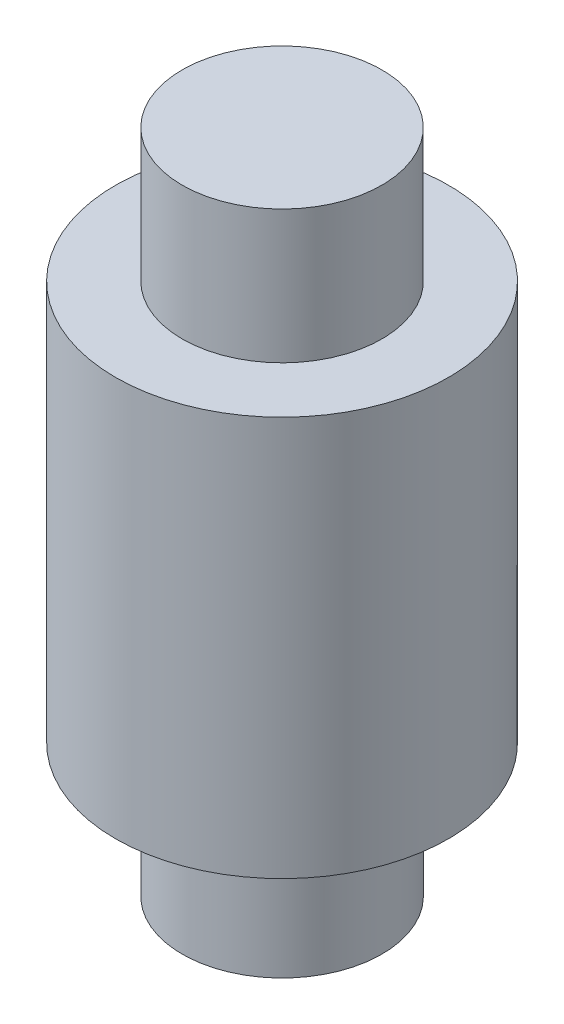
ISO-10303-21;
HEADER;
FILE_DESCRIPTION(('STEP AP214'),'2;1');
FILE_NAME('part.step','',(''),(''),'','','');
FILE_SCHEMA(('AUTOMOTIVE_DESIGN { 1 0 10303 214 1 1 1 1 }'));
ENDSEC;
DATA;
#1=APPLICATION_CONTEXT('core data for automotive mechanical design processes');
#2=APPLICATION_PROTOCOL_DEFINITION('international standard','automotive_design',2000,#1);
#3=PRODUCT_CONTEXT('',#1,'mechanical');
#4=PRODUCT('Part','Part','',(#3));
#5=PRODUCT_RELATED_PRODUCT_CATEGORY('part','',(#4));
#6=PRODUCT_DEFINITION_FORMATION('','',#4);
#7=PRODUCT_DEFINITION_CONTEXT('part definition',#1,'design');
#8=PRODUCT_DEFINITION('design','',#6,#7);
#9=PRODUCT_DEFINITION_SHAPE('','',#8);
#10=(LENGTH_UNIT() NAMED_UNIT(*) SI_UNIT(.MILLI.,.METRE.));
#11=(NAMED_UNIT(*) PLANE_ANGLE_UNIT() SI_UNIT($,.RADIAN.));
#12=(NAMED_UNIT(*) SI_UNIT($,.STERADIAN.) SOLID_ANGLE_UNIT());
#13=UNCERTAINTY_MEASURE_WITH_UNIT(LENGTH_MEASURE(1.E-05),#10,'distance_accuracy_value','');
#14=(GEOMETRIC_REPRESENTATION_CONTEXT(3) GLOBAL_UNCERTAINTY_ASSIGNED_CONTEXT((#13)) GLOBAL_UNIT_ASSIGNED_CONTEXT((#10,
#11,#12)) REPRESENTATION_CONTEXT('',''));
#15=CARTESIAN_POINT('',(0.,0.,0.));
#16=DIRECTION('',(0.,0.,1.));
#17=DIRECTION('',(1.,0.,0.));
#18=AXIS2_PLACEMENT_3D('',#15,#16,#17);
#19=CARTESIAN_POINT('',(0.,6.,0.));
#20=DIRECTION('',(0.,-1.,0.));
#21=DIRECTION('',(0.,0.,-1.));
#22=AXIS2_PLACEMENT_3D('',#19,#20,#21);
#23=CYLINDRICAL_SURFACE('',#22,2.5);
#24=CARTESIAN_POINT('',(0.,6.,0.));
#25=DIRECTION('',(0.,1.,0.));
#26=DIRECTION('',(0.,0.,1.));
#27=AXIS2_PLACEMENT_3D('',#24,#25,#26);
#28=CIRCLE('',#27,2.5);
#29=CARTESIAN_POINT('',(0.,6.,2.5));
#30=VERTEX_POINT('',#29);
#31=EDGE_CURVE('E46',#30,#30,#28,.T.);
#32=ORIENTED_EDGE('',*,*,#31,.F.);
#33=EDGE_LOOP('',(#32));
#34=FACE_BOUND('',#33,.T.);
#35=CARTESIAN_POINT('',(0.,0.,0.));
#36=DIRECTION('',(0.,1.,0.));
#37=DIRECTION('',(0.,0.,1.));
#38=AXIS2_PLACEMENT_3D('',#35,#36,#37);
#39=CIRCLE('',#38,2.5);
#40=CARTESIAN_POINT('',(0.,0.,2.5));
#41=VERTEX_POINT('',#40);
#42=EDGE_CURVE('E37',#41,#41,#39,.T.);
#43=ORIENTED_EDGE('',*,*,#42,.T.);
#44=EDGE_LOOP('',(#43));
#45=FACE_BOUND('',#44,.T.);
#46=ADVANCED_FACE('F34',(#34,#45),#23,.T.);
#47=CARTESIAN_POINT('',(0.,6.,0.));
#48=DIRECTION('',(0.,1.,0.));
#49=DIRECTION('',(0.,0.,1.));
#50=AXIS2_PLACEMENT_3D('',#47,#48,#49);
#51=PLANE('',#50);
#52=CARTESIAN_POINT('',(0.,6.,0.));
#53=DIRECTION('',(0.,1.,0.));
#54=DIRECTION('',(0.,0.,1.));
#55=AXIS2_PLACEMENT_3D('',#52,#53,#54);
#56=CIRCLE('',#55,1.5);
#57=CARTESIAN_POINT('',(0.,6.,1.5));
#58=VERTEX_POINT('',#57);
#59=EDGE_CURVE('E41',#58,#58,#56,.T.);
#60=ORIENTED_EDGE('',*,*,#59,.F.);
#61=EDGE_LOOP('',(#60));
#62=FACE_BOUND('',#61,.T.);
#63=ORIENTED_EDGE('',*,*,#31,.T.);
#64=EDGE_LOOP('',(#63));
#65=FACE_BOUND('',#64,.T.);
#66=ADVANCED_FACE('F63',(#62,#65),#51,.T.);
#67=CARTESIAN_POINT('',(0.,0.,0.));
#68=DIRECTION('',(0.,1.,0.));
#69=DIRECTION('',(0.,0.,1.));
#70=AXIS2_PLACEMENT_3D('',#67,#68,#69);
#71=PLANE('',#70);
#72=CARTESIAN_POINT('',(0.,0.,0.));
#73=DIRECTION('',(0.,-1.,0.));
#74=DIRECTION('',(0.,0.,-1.));
#75=AXIS2_PLACEMENT_3D('',#72,#73,#74);
#76=CIRCLE('',#75,1.5);
#77=CARTESIAN_POINT('',(0.,0.,-1.5));
#78=VERTEX_POINT('',#77);
#79=EDGE_CURVE('E10',#78,#78,#76,.T.);
#80=ORIENTED_EDGE('',*,*,#79,.F.);
#81=EDGE_LOOP('',(#80));
#82=FACE_BOUND('',#81,.T.);
#83=ORIENTED_EDGE('',*,*,#42,.F.);
#84=EDGE_LOOP('',(#83));
#85=FACE_BOUND('',#84,.T.);
#86=ADVANCED_FACE('F60',(#82,#85),#71,.F.);
#87=CARTESIAN_POINT('',(0.,8.,0.));
#88=DIRECTION('',(0.,-1.,0.));
#89=DIRECTION('',(0.,0.,-1.));
#90=AXIS2_PLACEMENT_3D('',#87,#88,#89);
#91=CYLINDRICAL_SURFACE('',#90,1.5);
#92=CARTESIAN_POINT('',(0.,8.,0.));
#93=DIRECTION('',(0.,1.,0.));
#94=DIRECTION('',(0.,0.,1.));
#95=AXIS2_PLACEMENT_3D('',#92,#93,#94);
#96=CIRCLE('',#95,1.5);
#97=CARTESIAN_POINT('',(0.,8.,1.5));
#98=VERTEX_POINT('',#97);
#99=EDGE_CURVE('E51',#98,#98,#96,.T.);
#100=ORIENTED_EDGE('',*,*,#99,.F.);
#101=EDGE_LOOP('',(#100));
#102=FACE_BOUND('',#101,.T.);
#103=ORIENTED_EDGE('',*,*,#59,.T.);
#104=EDGE_LOOP('',(#103));
#105=FACE_BOUND('',#104,.T.);
#106=ADVANCED_FACE('F62',(#102,#105),#91,.T.);
#107=CARTESIAN_POINT('',(0.,8.,0.));
#108=DIRECTION('',(0.,1.,0.));
#109=DIRECTION('',(0.,0.,1.));
#110=AXIS2_PLACEMENT_3D('',#107,#108,#109);
#111=PLANE('',#110);
#112=ORIENTED_EDGE('',*,*,#99,.T.);
#113=EDGE_LOOP('',(#112));
#114=FACE_BOUND('',#113,.T.);
#115=ADVANCED_FACE('F69',(#114),#111,.T.);
#116=CARTESIAN_POINT('',(0.,-2.,0.));
#117=DIRECTION('',(0.,1.,0.));
#118=DIRECTION('',(0.,0.,1.));
#119=AXIS2_PLACEMENT_3D('',#116,#117,#118);
#120=CYLINDRICAL_SURFACE('',#119,1.5);
#121=CARTESIAN_POINT('',(0.,-2.,0.));
#122=DIRECTION('',(0.,-1.,0.));
#123=DIRECTION('',(0.,0.,-1.));
#124=AXIS2_PLACEMENT_3D('',#121,#122,#123);
#125=CIRCLE('',#124,1.5);
#126=CARTESIAN_POINT('',(0.,-2.,-1.5));
#127=VERTEX_POINT('',#126);
#128=EDGE_CURVE('E50',#127,#127,#125,.T.);
#129=ORIENTED_EDGE('',*,*,#128,.F.);
#130=EDGE_LOOP('',(#129));
#131=FACE_BOUND('',#130,.T.);
#132=ORIENTED_EDGE('',*,*,#79,.T.);
#133=EDGE_LOOP('',(#132));
#134=FACE_BOUND('',#133,.T.);
#135=ADVANCED_FACE('F97',(#131,#134),#120,.T.);
#136=CARTESIAN_POINT('',(0.,-2.,0.));
#137=DIRECTION('',(0.,-1.,0.));
#138=DIRECTION('',(0.,0.,-1.));
#139=AXIS2_PLACEMENT_3D('',#136,#137,#138);
#140=PLANE('',#139);
#141=ORIENTED_EDGE('',*,*,#128,.T.);
#142=EDGE_LOOP('',(#141));
#143=FACE_BOUND('',#142,.T.);
#144=ADVANCED_FACE('F111',(#143),#140,.T.);
#145=CLOSED_SHELL('',(#46,#66,#86,#106,#115,#135,#144));
#146=MANIFOLD_SOLID_BREP('B2',#145);
#147=ADVANCED_BREP_SHAPE_REPRESENTATION('',(#18,#146),#14);
#148=SHAPE_DEFINITION_REPRESENTATION(#9,#147);
ENDSEC;
END-ISO-10303-21;
